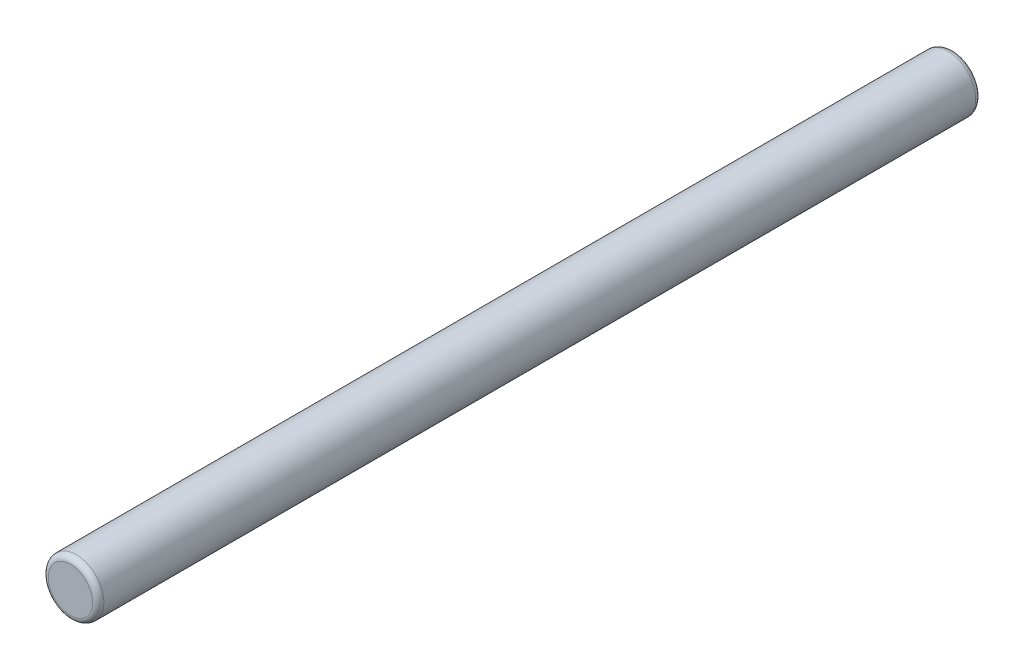
ISO-10303-21;
HEADER;
FILE_DESCRIPTION(('STEP AP214'),'2;1');
FILE_NAME('part.step','',(''),(''),'','','');
FILE_SCHEMA(('AUTOMOTIVE_DESIGN { 1 0 10303 214 1 1 1 1 }'));
ENDSEC;
DATA;
#1=APPLICATION_CONTEXT('core data for automotive mechanical design processes');
#2=APPLICATION_PROTOCOL_DEFINITION('international standard','automotive_design',2000,#1);
#3=PRODUCT_CONTEXT('',#1,'mechanical');
#4=PRODUCT('Part','Part','',(#3));
#5=PRODUCT_RELATED_PRODUCT_CATEGORY('part','',(#4));
#6=PRODUCT_DEFINITION_FORMATION('','',#4);
#7=PRODUCT_DEFINITION_CONTEXT('part definition',#1,'design');
#8=PRODUCT_DEFINITION('design','',#6,#7);
#9=PRODUCT_DEFINITION_SHAPE('','',#8);
#10=(LENGTH_UNIT() NAMED_UNIT(*) SI_UNIT(.MILLI.,.METRE.));
#11=(NAMED_UNIT(*) PLANE_ANGLE_UNIT() SI_UNIT($,.RADIAN.));
#12=(NAMED_UNIT(*) SI_UNIT($,.STERADIAN.) SOLID_ANGLE_UNIT());
#13=UNCERTAINTY_MEASURE_WITH_UNIT(LENGTH_MEASURE(1.E-05),#10,'distance_accuracy_value','');
#14=(GEOMETRIC_REPRESENTATION_CONTEXT(3) GLOBAL_UNCERTAINTY_ASSIGNED_CONTEXT((#13)) GLOBAL_UNIT_ASSIGNED_CONTEXT((#10,
#11,#12)) REPRESENTATION_CONTEXT('',''));
#15=CARTESIAN_POINT('',(0.,0.,0.));
#16=DIRECTION('',(0.,0.,1.));
#17=DIRECTION('',(1.,0.,0.));
#18=AXIS2_PLACEMENT_3D('',#15,#16,#17);
#19=CARTESIAN_POINT('',(0.,0.,0.508));
#20=DIRECTION('',(0.,0.,1.));
#21=DIRECTION('',(1.,0.,0.));
#22=AXIS2_PLACEMENT_3D('',#19,#20,#21);
#23=TOROIDAL_SURFACE('',#22,1.99199999993366,0.508);
#24=CARTESIAN_POINT('',(0.,0.,0.508));
#25=DIRECTION('',(0.,0.,1.));
#26=DIRECTION('',(1.,0.,0.));
#27=AXIS2_PLACEMENT_3D('',#24,#25,#26);
#28=CIRCLE('',#27,2.49999999993366);
#29=CARTESIAN_POINT('',(2.49999999993366,0.,0.508));
#30=VERTEX_POINT('',#29);
#31=EDGE_CURVE('E48',#30,#30,#28,.T.);
#32=ORIENTED_EDGE('',*,*,#31,.F.);
#33=EDGE_LOOP('',(#32));
#34=FACE_BOUND('',#33,.T.);
#35=CARTESIAN_POINT('',(0.,0.,0.));
#36=DIRECTION('',(0.,0.,-1.));
#37=DIRECTION('',(1.,0.,0.));
#38=AXIS2_PLACEMENT_3D('',#35,#36,#37);
#39=CIRCLE('',#38,1.99199999993366);
#40=CARTESIAN_POINT('',(1.99199999993366,0.,0.));
#41=VERTEX_POINT('',#40);
#42=EDGE_CURVE('E11',#41,#41,#39,.T.);
#43=ORIENTED_EDGE('',*,*,#42,.F.);
#44=EDGE_LOOP('',(#43));
#45=FACE_BOUND('',#44,.T.);
#46=ADVANCED_FACE('F17',(#34,#45),#23,.T.);
#47=CARTESIAN_POINT('',(0.,0.,78.9305));
#48=DIRECTION('',(0.,0.,1.));
#49=DIRECTION('',(1.,0.,0.));
#50=AXIS2_PLACEMENT_3D('',#47,#48,#49);
#51=TOROIDAL_SURFACE('',#50,1.99199999993366,0.508);
#52=CARTESIAN_POINT('',(0.,0.,79.4385));
#53=DIRECTION('',(0.,0.,1.));
#54=DIRECTION('',(1.,0.,0.));
#55=AXIS2_PLACEMENT_3D('',#52,#53,#54);
#56=CIRCLE('',#55,1.99199999993366);
#57=CARTESIAN_POINT('',(1.99199999993366,0.,79.4385));
#58=VERTEX_POINT('',#57);
#59=EDGE_CURVE('E28',#58,#58,#56,.T.);
#60=ORIENTED_EDGE('',*,*,#59,.F.);
#61=EDGE_LOOP('',(#60));
#62=FACE_BOUND('',#61,.T.);
#63=CARTESIAN_POINT('',(0.,0.,78.9305));
#64=DIRECTION('',(0.,0.,-1.));
#65=DIRECTION('',(1.,0.,0.));
#66=AXIS2_PLACEMENT_3D('',#63,#64,#65);
#67=CIRCLE('',#66,2.49999999993366);
#68=CARTESIAN_POINT('',(2.49999999993366,0.,78.9305));
#69=VERTEX_POINT('',#68);
#70=EDGE_CURVE('E21',#69,#69,#67,.T.);
#71=ORIENTED_EDGE('',*,*,#70,.F.);
#72=EDGE_LOOP('',(#71));
#73=FACE_BOUND('',#72,.T.);
#74=ADVANCED_FACE('F64',(#62,#73),#51,.T.);
#75=CARTESIAN_POINT('',(0.,0.,0.));
#76=DIRECTION('',(0.,0.,1.));
#77=DIRECTION('',(1.,0.,0.));
#78=AXIS2_PLACEMENT_3D('',#75,#76,#77);
#79=PLANE('',#78);
#80=ORIENTED_EDGE('',*,*,#42,.T.);
#81=EDGE_LOOP('',(#80));
#82=FACE_BOUND('',#81,.T.);
#83=ADVANCED_FACE('F66',(#82),#79,.F.);
#84=CARTESIAN_POINT('',(0.,0.,79.4385));
#85=DIRECTION('',(0.,0.,1.));
#86=DIRECTION('',(1.,0.,0.));
#87=AXIS2_PLACEMENT_3D('',#84,#85,#86);
#88=PLANE('',#87);
#89=ORIENTED_EDGE('',*,*,#59,.T.);
#90=EDGE_LOOP('',(#89));
#91=FACE_BOUND('',#90,.T.);
#92=ADVANCED_FACE('F19',(#91),#88,.T.);
#93=CARTESIAN_POINT('',(0.,0.,79.4385));
#94=DIRECTION('',(0.,0.,-1.));
#95=DIRECTION('',(-1.,0.,0.));
#96=AXIS2_PLACEMENT_3D('',#93,#94,#95);
#97=CYLINDRICAL_SURFACE('',#96,2.49999999993366);
#98=ORIENTED_EDGE('',*,*,#31,.T.);
#99=EDGE_LOOP('',(#98));
#100=FACE_BOUND('',#99,.T.);
#101=ORIENTED_EDGE('',*,*,#70,.T.);
#102=EDGE_LOOP('',(#101));
#103=FACE_BOUND('',#102,.T.);
#104=ADVANCED_FACE('F49',(#100,#103),#97,.T.);
#105=CLOSED_SHELL('',(#46,#74,#83,#92,#104));
#106=MANIFOLD_SOLID_BREP('B1',#105);
#107=ADVANCED_BREP_SHAPE_REPRESENTATION('',(#18,#106),#14);
#108=SHAPE_DEFINITION_REPRESENTATION(#9,#107);
ENDSEC;
END-ISO-10303-21;
